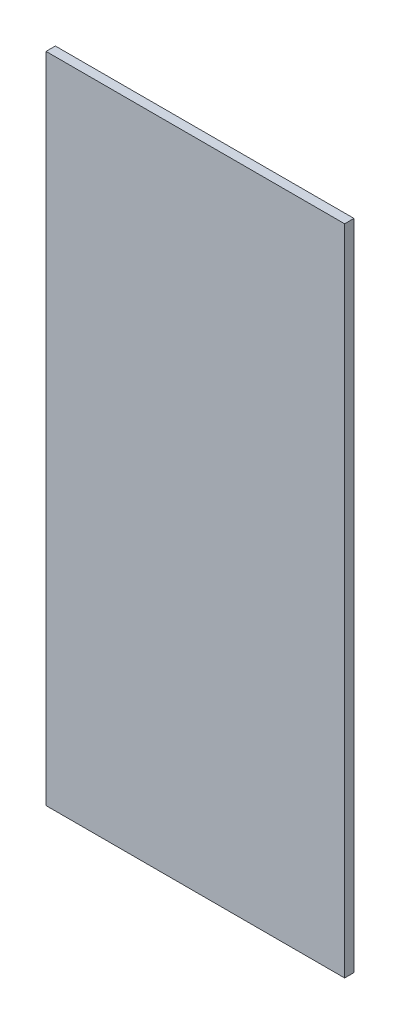
ISO-10303-21;
HEADER;
FILE_DESCRIPTION(('STEP AP214'),'2;1');
FILE_NAME('part.step','',(''),(''),'','','');
FILE_SCHEMA(('AUTOMOTIVE_DESIGN { 1 0 10303 214 1 1 1 1 }'));
ENDSEC;
DATA;
#1=APPLICATION_CONTEXT('core data for automotive mechanical design processes');
#2=APPLICATION_PROTOCOL_DEFINITION('international standard','automotive_design',2000,#1);
#3=PRODUCT_CONTEXT('',#1,'mechanical');
#4=PRODUCT('Part','Part','',(#3));
#5=PRODUCT_RELATED_PRODUCT_CATEGORY('part','',(#4));
#6=PRODUCT_DEFINITION_FORMATION('','',#4);
#7=PRODUCT_DEFINITION_CONTEXT('part definition',#1,'design');
#8=PRODUCT_DEFINITION('design','',#6,#7);
#9=PRODUCT_DEFINITION_SHAPE('','',#8);
#10=(LENGTH_UNIT() NAMED_UNIT(*) SI_UNIT(.MILLI.,.METRE.));
#11=(NAMED_UNIT(*) PLANE_ANGLE_UNIT() SI_UNIT($,.RADIAN.));
#12=(NAMED_UNIT(*) SI_UNIT($,.STERADIAN.) SOLID_ANGLE_UNIT());
#13=UNCERTAINTY_MEASURE_WITH_UNIT(LENGTH_MEASURE(1.E-05),#10,'distance_accuracy_value','');
#14=(GEOMETRIC_REPRESENTATION_CONTEXT(3) GLOBAL_UNCERTAINTY_ASSIGNED_CONTEXT((#13)) GLOBAL_UNIT_ASSIGNED_CONTEXT((#10,
#11,#12)) REPRESENTATION_CONTEXT('',''));
#15=CARTESIAN_POINT('',(0.,0.,0.));
#16=DIRECTION('',(0.,0.,1.));
#17=DIRECTION('',(1.,0.,0.));
#18=AXIS2_PLACEMENT_3D('',#15,#16,#17);
#19=CARTESIAN_POINT('',(0.,0.,10.));
#20=DIRECTION('',(1.,0.,0.));
#21=DIRECTION('',(0.,0.,-1.));
#22=AXIS2_PLACEMENT_3D('',#19,#20,#21);
#23=PLANE('',#22);
#24=DIRECTION('',(0.,-1.,0.));
#25=VECTOR('',#24,1.);
#26=CARTESIAN_POINT('',(0.,0.,0.));
#27=LINE('',#26,#25);
#28=CARTESIAN_POINT('',(0.,700.,0.));
#29=VERTEX_POINT('',#28);
#30=CARTESIAN_POINT('',(0.,0.,0.));
#31=VERTEX_POINT('',#30);
#32=EDGE_CURVE('E96',#29,#31,#27,.T.);
#33=ORIENTED_EDGE('',*,*,#32,.T.);
#34=DIRECTION('',(0.,0.,-1.));
#35=VECTOR('',#34,1.);
#36=CARTESIAN_POINT('',(0.,0.,10.));
#37=LINE('',#36,#35);
#38=CARTESIAN_POINT('',(0.,0.,10.));
#39=VERTEX_POINT('',#38);
#40=EDGE_CURVE('E11',#39,#31,#37,.T.);
#41=ORIENTED_EDGE('',*,*,#40,.F.);
#42=DIRECTION('',(0.,-1.,0.));
#43=VECTOR('',#42,1.);
#44=CARTESIAN_POINT('',(0.,0.,10.));
#45=LINE('',#44,#43);
#46=CARTESIAN_POINT('',(0.,700.,10.));
#47=VERTEX_POINT('',#46);
#48=EDGE_CURVE('E84',#47,#39,#45,.T.);
#49=ORIENTED_EDGE('',*,*,#48,.F.);
#50=DIRECTION('',(0.,0.,-1.));
#51=VECTOR('',#50,1.);
#52=CARTESIAN_POINT('',(0.,700.,10.));
#53=LINE('',#52,#51);
#54=EDGE_CURVE('E92',#47,#29,#53,.T.);
#55=ORIENTED_EDGE('',*,*,#54,.T.);
#56=EDGE_LOOP('',(#33,#41,#49,#55));
#57=FACE_BOUND('',#56,.T.);
#58=ADVANCED_FACE('F33',(#57),#23,.F.);
#59=CARTESIAN_POINT('',(0.,0.,10.));
#60=DIRECTION('',(0.,1.,0.));
#61=DIRECTION('',(0.,0.,1.));
#62=AXIS2_PLACEMENT_3D('',#59,#60,#61);
#63=PLANE('',#62);
#64=DIRECTION('',(1.,0.,0.));
#65=VECTOR('',#64,1.);
#66=CARTESIAN_POINT('',(0.,0.,0.));
#67=LINE('',#66,#65);
#68=CARTESIAN_POINT('',(320.,0.,0.));
#69=VERTEX_POINT('',#68);
#70=EDGE_CURVE('E88',#31,#69,#67,.T.);
#71=ORIENTED_EDGE('',*,*,#70,.T.);
#72=DIRECTION('',(0.,0.,-1.));
#73=VECTOR('',#72,1.);
#74=CARTESIAN_POINT('',(320.,0.,10.));
#75=LINE('',#74,#73);
#76=CARTESIAN_POINT('',(320.,0.,10.));
#77=VERTEX_POINT('',#76);
#78=EDGE_CURVE('E41',#77,#69,#75,.T.);
#79=ORIENTED_EDGE('',*,*,#78,.F.);
#80=DIRECTION('',(1.,0.,0.));
#81=VECTOR('',#80,1.);
#82=CARTESIAN_POINT('',(0.,0.,10.));
#83=LINE('',#82,#81);
#84=EDGE_CURVE('E79',#39,#77,#83,.T.);
#85=ORIENTED_EDGE('',*,*,#84,.F.);
#86=ORIENTED_EDGE('',*,*,#40,.T.);
#87=EDGE_LOOP('',(#71,#79,#85,#86));
#88=FACE_BOUND('',#87,.T.);
#89=ADVANCED_FACE('F87',(#88),#63,.F.);
#90=CARTESIAN_POINT('',(320.,0.,10.));
#91=DIRECTION('',(-1.,0.,0.));
#92=DIRECTION('',(0.,0.,1.));
#93=AXIS2_PLACEMENT_3D('',#90,#91,#92);
#94=PLANE('',#93);
#95=DIRECTION('',(0.,1.,0.));
#96=VECTOR('',#95,1.);
#97=CARTESIAN_POINT('',(320.,0.,0.));
#98=LINE('',#97,#96);
#99=CARTESIAN_POINT('',(320.,700.,0.));
#100=VERTEX_POINT('',#99);
#101=EDGE_CURVE('E66',#69,#100,#98,.T.);
#102=ORIENTED_EDGE('',*,*,#101,.T.);
#103=DIRECTION('',(0.,0.,-1.));
#104=VECTOR('',#103,1.);
#105=CARTESIAN_POINT('',(320.,700.,10.));
#106=LINE('',#105,#104);
#107=CARTESIAN_POINT('',(320.,700.,10.));
#108=VERTEX_POINT('',#107);
#109=EDGE_CURVE('E89',#108,#100,#106,.T.);
#110=ORIENTED_EDGE('',*,*,#109,.F.);
#111=DIRECTION('',(0.,1.,0.));
#112=VECTOR('',#111,1.);
#113=CARTESIAN_POINT('',(320.,0.,10.));
#114=LINE('',#113,#112);
#115=EDGE_CURVE('E82',#77,#108,#114,.T.);
#116=ORIENTED_EDGE('',*,*,#115,.F.);
#117=ORIENTED_EDGE('',*,*,#78,.T.);
#118=EDGE_LOOP('',(#102,#110,#116,#117));
#119=FACE_BOUND('',#118,.T.);
#120=ADVANCED_FACE('F90',(#119),#94,.F.);
#121=CARTESIAN_POINT('',(0.,700.,10.));
#122=DIRECTION('',(0.,-1.,0.));
#123=DIRECTION('',(0.,0.,-1.));
#124=AXIS2_PLACEMENT_3D('',#121,#122,#123);
#125=PLANE('',#124);
#126=DIRECTION('',(-1.,0.,0.));
#127=VECTOR('',#126,1.);
#128=CARTESIAN_POINT('',(0.,700.,0.));
#129=LINE('',#128,#127);
#130=EDGE_CURVE('E72',#100,#29,#129,.T.);
#131=ORIENTED_EDGE('',*,*,#130,.T.);
#132=ORIENTED_EDGE('',*,*,#54,.F.);
#133=DIRECTION('',(-1.,0.,0.));
#134=VECTOR('',#133,1.);
#135=CARTESIAN_POINT('',(0.,700.,10.));
#136=LINE('',#135,#134);
#137=EDGE_CURVE('E49',#108,#47,#136,.T.);
#138=ORIENTED_EDGE('',*,*,#137,.F.);
#139=ORIENTED_EDGE('',*,*,#109,.T.);
#140=EDGE_LOOP('',(#131,#132,#138,#139));
#141=FACE_BOUND('',#140,.T.);
#142=ADVANCED_FACE('F103',(#141),#125,.F.);
#143=CARTESIAN_POINT('',(0.,0.,10.));
#144=DIRECTION('',(0.,0.,-1.));
#145=DIRECTION('',(-1.,0.,0.));
#146=AXIS2_PLACEMENT_3D('',#143,#144,#145);
#147=PLANE('',#146);
#148=ORIENTED_EDGE('',*,*,#48,.T.);
#149=ORIENTED_EDGE('',*,*,#84,.T.);
#150=ORIENTED_EDGE('',*,*,#115,.T.);
#151=ORIENTED_EDGE('',*,*,#137,.T.);
#152=EDGE_LOOP('',(#148,#149,#150,#151));
#153=FACE_BOUND('',#152,.T.);
#154=ADVANCED_FACE('F80',(#153),#147,.F.);
#155=CARTESIAN_POINT('',(0.,0.,0.));
#156=DIRECTION('',(0.,0.,-1.));
#157=DIRECTION('',(-1.,0.,0.));
#158=AXIS2_PLACEMENT_3D('',#155,#156,#157);
#159=PLANE('',#158);
#160=ORIENTED_EDGE('',*,*,#32,.F.);
#161=ORIENTED_EDGE('',*,*,#130,.F.);
#162=ORIENTED_EDGE('',*,*,#101,.F.);
#163=ORIENTED_EDGE('',*,*,#70,.F.);
#164=EDGE_LOOP('',(#160,#161,#162,#163));
#165=FACE_BOUND('',#164,.T.);
#166=ADVANCED_FACE('F106',(#165),#159,.T.);
#167=CLOSED_SHELL('',(#58,#89,#120,#142,#154,#166));
#168=MANIFOLD_SOLID_BREP('B2',#167);
#169=ADVANCED_BREP_SHAPE_REPRESENTATION('',(#18,#168),#14);
#170=SHAPE_DEFINITION_REPRESENTATION(#9,#169);
ENDSEC;
END-ISO-10303-21;
